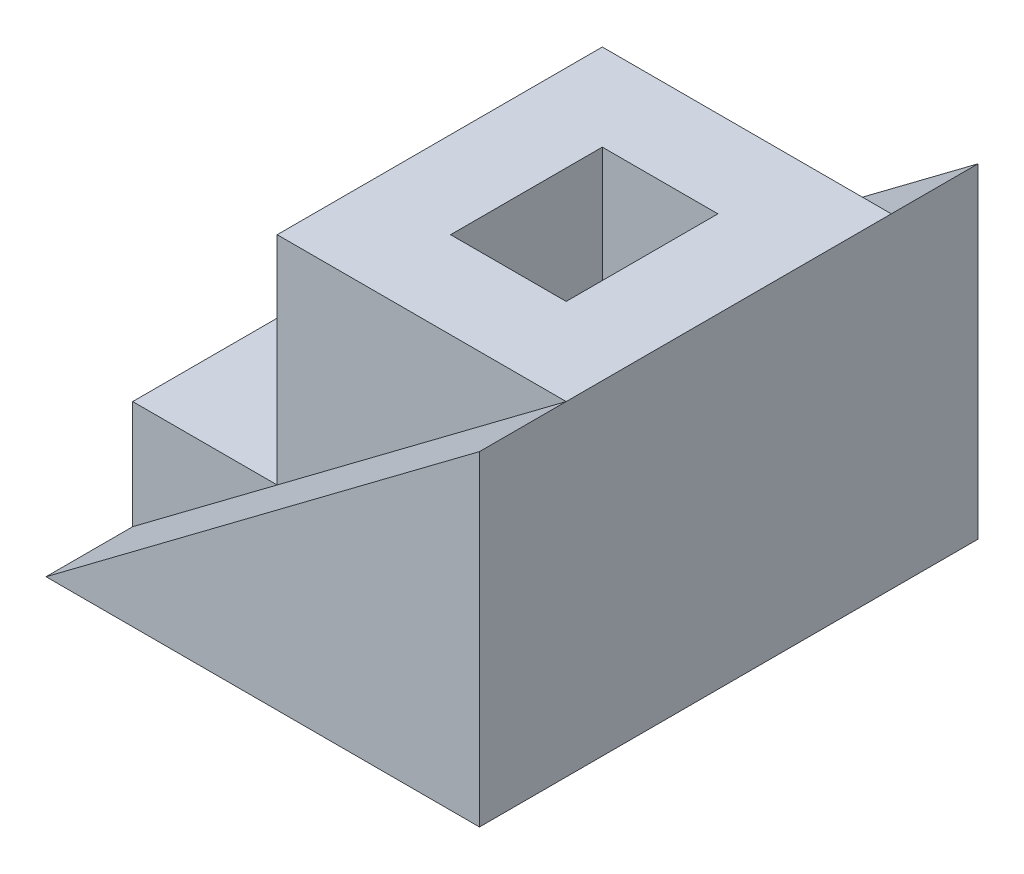
ISO-10303-21;
HEADER;
FILE_DESCRIPTION(('STEP AP214'),'2;1');
FILE_NAME('part.step','',(''),(''),'','','');
FILE_SCHEMA(('AUTOMOTIVE_DESIGN { 1 0 10303 214 1 1 1 1 }'));
ENDSEC;
DATA;
#1=APPLICATION_CONTEXT('core data for automotive mechanical design processes');
#2=APPLICATION_PROTOCOL_DEFINITION('international standard','automotive_design',2000,#1);
#3=PRODUCT_CONTEXT('',#1,'mechanical');
#4=PRODUCT('Part','Part','',(#3));
#5=PRODUCT_RELATED_PRODUCT_CATEGORY('part','',(#4));
#6=PRODUCT_DEFINITION_FORMATION('','',#4);
#7=PRODUCT_DEFINITION_CONTEXT('part definition',#1,'design');
#8=PRODUCT_DEFINITION('design','',#6,#7);
#9=PRODUCT_DEFINITION_SHAPE('','',#8);
#10=(LENGTH_UNIT() NAMED_UNIT(*) SI_UNIT(.MILLI.,.METRE.));
#11=(NAMED_UNIT(*) PLANE_ANGLE_UNIT() SI_UNIT($,.RADIAN.));
#12=(NAMED_UNIT(*) SI_UNIT($,.STERADIAN.) SOLID_ANGLE_UNIT());
#13=UNCERTAINTY_MEASURE_WITH_UNIT(LENGTH_MEASURE(1.E-05),#10,'distance_accuracy_value','');
#14=(GEOMETRIC_REPRESENTATION_CONTEXT(3) GLOBAL_UNCERTAINTY_ASSIGNED_CONTEXT((#13)) GLOBAL_UNIT_ASSIGNED_CONTEXT((#10,
#11,#12)) REPRESENTATION_CONTEXT('',''));
#15=CARTESIAN_POINT('',(0.,0.,0.));
#16=DIRECTION('',(0.,0.,1.));
#17=DIRECTION('',(1.,0.,0.));
#18=AXIS2_PLACEMENT_3D('',#15,#16,#17);
#19=CARTESIAN_POINT('',(0.,0.,-15.));
#20=DIRECTION('',(0.,0.,1.));
#21=DIRECTION('',(1.,0.,0.));
#22=AXIS2_PLACEMENT_3D('',#19,#20,#21);
#23=PLANE('',#22);
#24=DIRECTION('',(1.,0.,0.));
#25=VECTOR('',#24,1.);
#26=CARTESIAN_POINT('',(0.,15.,-15.));
#27=LINE('',#26,#25);
#28=CARTESIAN_POINT('',(-6.66666666666666,15.,-15.));
#29=VERTEX_POINT('',#28);
#30=CARTESIAN_POINT('',(20.,15.,-15.));
#31=VERTEX_POINT('',#30);
#32=EDGE_CURVE('E212',#29,#31,#27,.T.);
#33=ORIENTED_EDGE('',*,*,#32,.T.);
#34=DIRECTION('',(-0.8,-0.6,0.));
#35=VECTOR('',#34,1.);
#36=CARTESIAN_POINT('',(-20.,-15.,-15.));
#37=LINE('',#36,#35);
#38=CARTESIAN_POINT('',(-6.66666666666666,-5.,-15.));
#39=VERTEX_POINT('',#38);
#40=EDGE_CURVE('E45',#31,#39,#37,.T.);
#41=ORIENTED_EDGE('',*,*,#40,.T.);
#42=DIRECTION('',(0.,1.,0.));
#43=VECTOR('',#42,1.);
#44=CARTESIAN_POINT('',(-6.66666666666666,0.,-15.));
#45=LINE('',#44,#43);
#46=EDGE_CURVE('E204',#39,#29,#45,.T.);
#47=ORIENTED_EDGE('',*,*,#46,.T.);
#48=EDGE_LOOP('',(#33,#41,#47));
#49=FACE_BOUND('',#48,.T.);
#50=ADVANCED_FACE('F34',(#49),#23,.F.);
#51=CARTESIAN_POINT('',(0.,0.,15.));
#52=DIRECTION('',(0.,0.,1.));
#53=DIRECTION('',(1.,0.,0.));
#54=AXIS2_PLACEMENT_3D('',#51,#52,#53);
#55=PLANE('',#54);
#56=DIRECTION('',(-0.8,-0.6,0.));
#57=VECTOR('',#56,1.);
#58=CARTESIAN_POINT('',(-20.,-15.,15.));
#59=LINE('',#58,#57);
#60=CARTESIAN_POINT('',(20.,15.,15.));
#61=VERTEX_POINT('',#60);
#62=CARTESIAN_POINT('',(-6.66666666666666,-5.,15.));
#63=VERTEX_POINT('',#62);
#64=EDGE_CURVE('E176',#61,#63,#59,.T.);
#65=ORIENTED_EDGE('',*,*,#64,.F.);
#66=DIRECTION('',(1.,0.,0.));
#67=VECTOR('',#66,1.);
#68=CARTESIAN_POINT('',(0.,15.,15.));
#69=LINE('',#68,#67);
#70=CARTESIAN_POINT('',(-6.66666666666666,15.,15.));
#71=VERTEX_POINT('',#70);
#72=EDGE_CURVE('E201',#71,#61,#69,.T.);
#73=ORIENTED_EDGE('',*,*,#72,.F.);
#74=DIRECTION('',(0.,1.,0.));
#75=VECTOR('',#74,1.);
#76=CARTESIAN_POINT('',(-6.66666666666666,0.,15.));
#77=LINE('',#76,#75);
#78=EDGE_CURVE('E192',#63,#71,#77,.T.);
#79=ORIENTED_EDGE('',*,*,#78,.F.);
#80=EDGE_LOOP('',(#65,#73,#79));
#81=FACE_BOUND('',#80,.T.);
#82=ADVANCED_FACE('F237',(#81),#55,.T.);
#83=CARTESIAN_POINT('',(-6.66666666666666,0.,-15.));
#84=DIRECTION('',(1.,0.,0.));
#85=DIRECTION('',(0.,0.,-1.));
#86=AXIS2_PLACEMENT_3D('',#83,#84,#85);
#87=PLANE('',#86);
#88=DIRECTION('',(0.,0.,1.));
#89=VECTOR('',#88,1.);
#90=CARTESIAN_POINT('',(-6.66666666666666,-5.,-15.));
#91=LINE('',#90,#89);
#92=EDGE_CURVE('E38',#39,#63,#91,.T.);
#93=ORIENTED_EDGE('',*,*,#92,.T.);
#94=ORIENTED_EDGE('',*,*,#78,.T.);
#95=DIRECTION('',(0.,0.,1.));
#96=VECTOR('',#95,1.);
#97=CARTESIAN_POINT('',(-6.66666666666666,15.,-15.));
#98=LINE('',#97,#96);
#99=EDGE_CURVE('E215',#29,#71,#98,.T.);
#100=ORIENTED_EDGE('',*,*,#99,.F.);
#101=ORIENTED_EDGE('',*,*,#46,.F.);
#102=EDGE_LOOP('',(#93,#94,#100,#101));
#103=FACE_BOUND('',#102,.T.);
#104=ADVANCED_FACE('F36',(#103),#87,.F.);
#105=CARTESIAN_POINT('',(0.,15.,-15.));
#106=DIRECTION('',(0.,-1.,0.));
#107=DIRECTION('',(0.,0.,-1.));
#108=AXIS2_PLACEMENT_3D('',#105,#106,#107);
#109=PLANE('',#108);
#110=DIRECTION('',(1.,0.,0.));
#111=VECTOR('',#110,1.);
#112=CARTESIAN_POINT('',(1.33333333333334,15.,7.));
#113=LINE('',#112,#111);
#114=CARTESIAN_POINT('',(1.33333333333334,15.,7.));
#115=VERTEX_POINT('',#114);
#116=CARTESIAN_POINT('',(12.,15.,7.));
#117=VERTEX_POINT('',#116);
#118=EDGE_CURVE('E153',#115,#117,#113,.T.);
#119=ORIENTED_EDGE('',*,*,#118,.F.);
#120=DIRECTION('',(0.,0.,1.));
#121=VECTOR('',#120,1.);
#122=CARTESIAN_POINT('',(1.33333333333334,15.,-7.));
#123=LINE('',#122,#121);
#124=CARTESIAN_POINT('',(1.33333333333334,15.,-7.));
#125=VERTEX_POINT('',#124);
#126=EDGE_CURVE('E52',#125,#115,#123,.T.);
#127=ORIENTED_EDGE('',*,*,#126,.F.);
#128=DIRECTION('',(-1.,0.,0.));
#129=VECTOR('',#128,1.);
#130=CARTESIAN_POINT('',(12.,15.,-7.));
#131=LINE('',#130,#129);
#132=CARTESIAN_POINT('',(12.,15.,-7.));
#133=VERTEX_POINT('',#132);
#134=EDGE_CURVE('E144',#133,#125,#131,.T.);
#135=ORIENTED_EDGE('',*,*,#134,.F.);
#136=DIRECTION('',(0.,0.,-1.));
#137=VECTOR('',#136,1.);
#138=CARTESIAN_POINT('',(12.,15.,7.));
#139=LINE('',#138,#137);
#140=EDGE_CURVE('E147',#117,#133,#139,.T.);
#141=ORIENTED_EDGE('',*,*,#140,.F.);
#142=EDGE_LOOP('',(#119,#127,#135,#141));
#143=FACE_BOUND('',#142,.T.);
#144=ORIENTED_EDGE('',*,*,#99,.T.);
#145=ORIENTED_EDGE('',*,*,#72,.T.);
#146=DIRECTION('',(0.,0.,1.));
#147=VECTOR('',#146,1.);
#148=CARTESIAN_POINT('',(20.,15.,-15.));
#149=LINE('',#148,#147);
#150=EDGE_CURVE('E217',#31,#61,#149,.T.);
#151=ORIENTED_EDGE('',*,*,#150,.F.);
#152=ORIENTED_EDGE('',*,*,#32,.F.);
#153=EDGE_LOOP('',(#144,#145,#151,#152));
#154=FACE_BOUND('',#153,.T.);
#155=ADVANCED_FACE('F252',(#143,#154),#109,.F.);
#156=CARTESIAN_POINT('',(20.,0.,-15.));
#157=DIRECTION('',(1.,0.,0.));
#158=DIRECTION('',(0.,0.,-1.));
#159=AXIS2_PLACEMENT_3D('',#156,#157,#158);
#160=PLANE('',#159);
#161=ORIENTED_EDGE('',*,*,#150,.T.);
#162=DIRECTION('',(0.,0.,-1.));
#163=VECTOR('',#162,1.);
#164=CARTESIAN_POINT('',(20.,15.,23.));
#165=LINE('',#164,#163);
#166=CARTESIAN_POINT('',(20.,15.,23.));
#167=VERTEX_POINT('',#166);
#168=EDGE_CURVE('E189',#167,#61,#165,.T.);
#169=ORIENTED_EDGE('',*,*,#168,.F.);
#170=DIRECTION('',(0.,1.,0.));
#171=VECTOR('',#170,1.);
#172=CARTESIAN_POINT('',(20.,15.,23.));
#173=LINE('',#172,#171);
#174=CARTESIAN_POINT('',(20.,-15.,23.));
#175=VERTEX_POINT('',#174);
#176=EDGE_CURVE('E180',#175,#167,#173,.T.);
#177=ORIENTED_EDGE('',*,*,#176,.F.);
#178=DIRECTION('',(0.,0.,1.));
#179=VECTOR('',#178,1.);
#180=CARTESIAN_POINT('',(20.,-15.,-15.));
#181=LINE('',#180,#179);
#182=CARTESIAN_POINT('',(20.,-15.,-23.));
#183=VERTEX_POINT('',#182);
#184=EDGE_CURVE('E220',#183,#175,#181,.T.);
#185=ORIENTED_EDGE('',*,*,#184,.F.);
#186=DIRECTION('',(0.,1.,0.));
#187=VECTOR('',#186,1.);
#188=CARTESIAN_POINT('',(20.,15.,-23.));
#189=LINE('',#188,#187);
#190=CARTESIAN_POINT('',(20.,15.,-23.));
#191=VERTEX_POINT('',#190);
#192=EDGE_CURVE('E168',#183,#191,#189,.T.);
#193=ORIENTED_EDGE('',*,*,#192,.T.);
#194=DIRECTION('',(0.,0.,1.));
#195=VECTOR('',#194,1.);
#196=CARTESIAN_POINT('',(20.,15.,-23.));
#197=LINE('',#196,#195);
#198=EDGE_CURVE('E170',#191,#31,#197,.T.);
#199=ORIENTED_EDGE('',*,*,#198,.T.);
#200=EDGE_LOOP('',(#161,#169,#177,#185,#193,#199));
#201=FACE_BOUND('',#200,.T.);
#202=ADVANCED_FACE('F248',(#201),#160,.T.);
#203=CARTESIAN_POINT('',(0.,-15.,-15.));
#204=DIRECTION('',(0.,-1.,0.));
#205=DIRECTION('',(0.,0.,-1.));
#206=AXIS2_PLACEMENT_3D('',#203,#204,#205);
#207=PLANE('',#206);
#208=DIRECTION('',(0.,0.,1.));
#209=VECTOR('',#208,1.);
#210=CARTESIAN_POINT('',(1.33333333333334,-15.,-7.));
#211=LINE('',#210,#209);
#212=CARTESIAN_POINT('',(1.33333333333334,-15.,-7.));
#213=VERTEX_POINT('',#212);
#214=CARTESIAN_POINT('',(1.33333333333334,-15.,7.));
#215=VERTEX_POINT('',#214);
#216=EDGE_CURVE('E128',#213,#215,#211,.T.);
#217=ORIENTED_EDGE('',*,*,#216,.T.);
#218=DIRECTION('',(1.,0.,0.));
#219=VECTOR('',#218,1.);
#220=CARTESIAN_POINT('',(1.33333333333334,-15.,7.));
#221=LINE('',#220,#219);
#222=CARTESIAN_POINT('',(12.,-15.,7.));
#223=VERTEX_POINT('',#222);
#224=EDGE_CURVE('E137',#215,#223,#221,.T.);
#225=ORIENTED_EDGE('',*,*,#224,.T.);
#226=DIRECTION('',(0.,0.,-1.));
#227=VECTOR('',#226,1.);
#228=CARTESIAN_POINT('',(12.,-15.,7.));
#229=LINE('',#228,#227);
#230=CARTESIAN_POINT('',(12.,-15.,-7.));
#231=VERTEX_POINT('',#230);
#232=EDGE_CURVE('E60',#223,#231,#229,.T.);
#233=ORIENTED_EDGE('',*,*,#232,.T.);
#234=DIRECTION('',(-1.,0.,0.));
#235=VECTOR('',#234,1.);
#236=CARTESIAN_POINT('',(12.,-15.,-7.));
#237=LINE('',#236,#235);
#238=EDGE_CURVE('E134',#231,#213,#237,.T.);
#239=ORIENTED_EDGE('',*,*,#238,.T.);
#240=EDGE_LOOP('',(#217,#225,#233,#239));
#241=FACE_BOUND('',#240,.T.);
#242=ORIENTED_EDGE('',*,*,#184,.T.);
#243=DIRECTION('',(1.,0.,0.));
#244=VECTOR('',#243,1.);
#245=CARTESIAN_POINT('',(20.,-15.,23.));
#246=LINE('',#245,#244);
#247=CARTESIAN_POINT('',(-20.,-15.,23.));
#248=VERTEX_POINT('',#247);
#249=EDGE_CURVE('E177',#248,#175,#246,.T.);
#250=ORIENTED_EDGE('',*,*,#249,.F.);
#251=DIRECTION('',(0.,0.,-1.));
#252=VECTOR('',#251,1.);
#253=CARTESIAN_POINT('',(-20.,-15.,23.));
#254=LINE('',#253,#252);
#255=CARTESIAN_POINT('',(-20.,-15.,15.));
#256=VERTEX_POINT('',#255);
#257=EDGE_CURVE('E184',#248,#256,#254,.T.);
#258=ORIENTED_EDGE('',*,*,#257,.T.);
#259=DIRECTION('',(0.,0.,1.));
#260=VECTOR('',#259,1.);
#261=CARTESIAN_POINT('',(-20.,-15.,-15.));
#262=LINE('',#261,#260);
#263=CARTESIAN_POINT('',(-20.,-15.,-15.));
#264=VERTEX_POINT('',#263);
#265=EDGE_CURVE('E222',#264,#256,#262,.T.);
#266=ORIENTED_EDGE('',*,*,#265,.F.);
#267=DIRECTION('',(0.,0.,1.));
#268=VECTOR('',#267,1.);
#269=CARTESIAN_POINT('',(-20.,-15.,-23.));
#270=LINE('',#269,#268);
#271=CARTESIAN_POINT('',(-20.,-15.,-23.));
#272=VERTEX_POINT('',#271);
#273=EDGE_CURVE('E174',#272,#264,#270,.T.);
#274=ORIENTED_EDGE('',*,*,#273,.F.);
#275=DIRECTION('',(1.,0.,0.));
#276=VECTOR('',#275,1.);
#277=CARTESIAN_POINT('',(20.,-15.,-23.));
#278=LINE('',#277,#276);
#279=EDGE_CURVE('E162',#272,#183,#278,.T.);
#280=ORIENTED_EDGE('',*,*,#279,.T.);
#281=EDGE_LOOP('',(#242,#250,#258,#266,#274,#280));
#282=FACE_BOUND('',#281,.T.);
#283=ADVANCED_FACE('F141',(#241,#282),#207,.T.);
#284=CARTESIAN_POINT('',(-20.,0.,-15.));
#285=DIRECTION('',(1.,0.,0.));
#286=DIRECTION('',(0.,0.,-1.));
#287=AXIS2_PLACEMENT_3D('',#284,#285,#286);
#288=PLANE('',#287);
#289=ORIENTED_EDGE('',*,*,#265,.T.);
#290=DIRECTION('',(0.,1.,0.));
#291=VECTOR('',#290,1.);
#292=CARTESIAN_POINT('',(-20.,0.,15.));
#293=LINE('',#292,#291);
#294=CARTESIAN_POINT('',(-20.,-5.,15.));
#295=VERTEX_POINT('',#294);
#296=EDGE_CURVE('E198',#256,#295,#293,.T.);
#297=ORIENTED_EDGE('',*,*,#296,.T.);
#298=DIRECTION('',(0.,0.,1.));
#299=VECTOR('',#298,1.);
#300=CARTESIAN_POINT('',(-20.,-5.,-15.));
#301=LINE('',#300,#299);
#302=CARTESIAN_POINT('',(-20.,-5.,-15.));
#303=VERTEX_POINT('',#302);
#304=EDGE_CURVE('E224',#303,#295,#301,.T.);
#305=ORIENTED_EDGE('',*,*,#304,.F.);
#306=DIRECTION('',(0.,1.,0.));
#307=VECTOR('',#306,1.);
#308=CARTESIAN_POINT('',(-20.,0.,-15.));
#309=LINE('',#308,#307);
#310=EDGE_CURVE('E210',#264,#303,#309,.T.);
#311=ORIENTED_EDGE('',*,*,#310,.F.);
#312=EDGE_LOOP('',(#289,#297,#305,#311));
#313=FACE_BOUND('',#312,.T.);
#314=ADVANCED_FACE('F260',(#313),#288,.F.);
#315=CARTESIAN_POINT('',(0.,-5.,-15.));
#316=DIRECTION('',(0.,-1.,0.));
#317=DIRECTION('',(0.,0.,-1.));
#318=AXIS2_PLACEMENT_3D('',#315,#316,#317);
#319=PLANE('',#318);
#320=ORIENTED_EDGE('',*,*,#304,.T.);
#321=DIRECTION('',(1.,0.,0.));
#322=VECTOR('',#321,1.);
#323=CARTESIAN_POINT('',(0.,-5.,15.));
#324=LINE('',#323,#322);
#325=EDGE_CURVE('E195',#295,#63,#324,.T.);
#326=ORIENTED_EDGE('',*,*,#325,.T.);
#327=ORIENTED_EDGE('',*,*,#92,.F.);
#328=DIRECTION('',(1.,0.,0.));
#329=VECTOR('',#328,1.);
#330=CARTESIAN_POINT('',(0.,-5.,-15.));
#331=LINE('',#330,#329);
#332=EDGE_CURVE('E207',#303,#39,#331,.T.);
#333=ORIENTED_EDGE('',*,*,#332,.F.);
#334=EDGE_LOOP('',(#320,#326,#327,#333));
#335=FACE_BOUND('',#334,.T.);
#336=ADVANCED_FACE('F238',(#335),#319,.F.);
#337=ORIENTED_EDGE('',*,*,#332,.T.);
#338=EDGE_CURVE('E11',#39,#264,#37,.T.);
#339=ORIENTED_EDGE('',*,*,#338,.T.);
#340=ORIENTED_EDGE('',*,*,#310,.T.);
#341=EDGE_LOOP('',(#337,#339,#340));
#342=FACE_BOUND('',#341,.T.);
#343=ADVANCED_FACE('F256',(#342),#23,.F.);
#344=EDGE_CURVE('E43',#63,#256,#59,.T.);
#345=ORIENTED_EDGE('',*,*,#344,.F.);
#346=ORIENTED_EDGE('',*,*,#325,.F.);
#347=ORIENTED_EDGE('',*,*,#296,.F.);
#348=EDGE_LOOP('',(#345,#346,#347));
#349=FACE_BOUND('',#348,.T.);
#350=ADVANCED_FACE('F261',(#349),#55,.T.);
#351=CARTESIAN_POINT('',(-20.,-15.,23.));
#352=DIRECTION('',(0.6,-0.8,0.));
#353=DIRECTION('',(0.8,0.6,0.));
#354=AXIS2_PLACEMENT_3D('',#351,#352,#353);
#355=PLANE('',#354);
#356=ORIENTED_EDGE('',*,*,#64,.T.);
#357=ORIENTED_EDGE('',*,*,#344,.T.);
#358=ORIENTED_EDGE('',*,*,#257,.F.);
#359=DIRECTION('',(-0.8,-0.6,0.));
#360=VECTOR('',#359,1.);
#361=CARTESIAN_POINT('',(-20.,-15.,23.));
#362=LINE('',#361,#360);
#363=EDGE_CURVE('E182',#167,#248,#362,.T.);
#364=ORIENTED_EDGE('',*,*,#363,.F.);
#365=ORIENTED_EDGE('',*,*,#168,.T.);
#366=EDGE_LOOP('',(#356,#357,#358,#364,#365));
#367=FACE_BOUND('',#366,.T.);
#368=ADVANCED_FACE('F242',(#367),#355,.F.);
#369=CARTESIAN_POINT('',(0.,0.,23.));
#370=DIRECTION('',(0.,0.,1.));
#371=DIRECTION('',(1.,0.,0.));
#372=AXIS2_PLACEMENT_3D('',#369,#370,#371);
#373=PLANE('',#372);
#374=ORIENTED_EDGE('',*,*,#249,.T.);
#375=ORIENTED_EDGE('',*,*,#176,.T.);
#376=ORIENTED_EDGE('',*,*,#363,.T.);
#377=EDGE_LOOP('',(#374,#375,#376));
#378=FACE_BOUND('',#377,.T.);
#379=ADVANCED_FACE('F268',(#378),#373,.T.);
#380=CARTESIAN_POINT('',(-20.,-15.,-23.));
#381=DIRECTION('',(-0.6,0.8,0.));
#382=DIRECTION('',(-0.8,-0.6,0.));
#383=AXIS2_PLACEMENT_3D('',#380,#381,#382);
#384=PLANE('',#383);
#385=ORIENTED_EDGE('',*,*,#40,.F.);
#386=ORIENTED_EDGE('',*,*,#198,.F.);
#387=DIRECTION('',(-0.8,-0.6,0.));
#388=VECTOR('',#387,1.);
#389=CARTESIAN_POINT('',(-20.,-15.,-23.));
#390=LINE('',#389,#388);
#391=EDGE_CURVE('E165',#191,#272,#390,.T.);
#392=ORIENTED_EDGE('',*,*,#391,.T.);
#393=ORIENTED_EDGE('',*,*,#273,.T.);
#394=ORIENTED_EDGE('',*,*,#338,.F.);
#395=EDGE_LOOP('',(#385,#386,#392,#393,#394));
#396=FACE_BOUND('',#395,.T.);
#397=ADVANCED_FACE('F299',(#396),#384,.T.);
#398=CARTESIAN_POINT('',(0.,0.,-23.));
#399=DIRECTION('',(0.,0.,-1.));
#400=DIRECTION('',(1.,0.,0.));
#401=AXIS2_PLACEMENT_3D('',#398,#399,#400);
#402=PLANE('',#401);
#403=ORIENTED_EDGE('',*,*,#279,.F.);
#404=ORIENTED_EDGE('',*,*,#391,.F.);
#405=ORIENTED_EDGE('',*,*,#192,.F.);
#406=EDGE_LOOP('',(#403,#404,#405));
#407=FACE_BOUND('',#406,.T.);
#408=ADVANCED_FACE('F304',(#407),#402,.T.);
#409=CARTESIAN_POINT('',(1.33333333333334,-15.,-7.));
#410=DIRECTION('',(-1.,0.,0.));
#411=DIRECTION('',(0.,0.,1.));
#412=AXIS2_PLACEMENT_3D('',#409,#410,#411);
#413=PLANE('',#412);
#414=ORIENTED_EDGE('',*,*,#126,.T.);
#415=DIRECTION('',(0.,1.,0.));
#416=VECTOR('',#415,1.);
#417=CARTESIAN_POINT('',(1.33333333333334,-15.,7.));
#418=LINE('',#417,#416);
#419=EDGE_CURVE('E124',#215,#115,#418,.T.);
#420=ORIENTED_EDGE('',*,*,#419,.F.);
#421=ORIENTED_EDGE('',*,*,#216,.F.);
#422=DIRECTION('',(0.,1.,0.));
#423=VECTOR('',#422,1.);
#424=CARTESIAN_POINT('',(1.33333333333334,-15.,-7.));
#425=LINE('',#424,#423);
#426=EDGE_CURVE('E157',#213,#125,#425,.T.);
#427=ORIENTED_EDGE('',*,*,#426,.T.);
#428=EDGE_LOOP('',(#414,#420,#421,#427));
#429=FACE_BOUND('',#428,.T.);
#430=ADVANCED_FACE('F126',(#429),#413,.F.);
#431=CARTESIAN_POINT('',(12.,-15.,-7.));
#432=DIRECTION('',(0.,0.,-1.));
#433=DIRECTION('',(-1.,0.,0.));
#434=AXIS2_PLACEMENT_3D('',#431,#432,#433);
#435=PLANE('',#434);
#436=ORIENTED_EDGE('',*,*,#134,.T.);
#437=ORIENTED_EDGE('',*,*,#426,.F.);
#438=ORIENTED_EDGE('',*,*,#238,.F.);
#439=DIRECTION('',(0.,1.,0.));
#440=VECTOR('',#439,1.);
#441=CARTESIAN_POINT('',(12.,-15.,-7.));
#442=LINE('',#441,#440);
#443=EDGE_CURVE('E159',#231,#133,#442,.T.);
#444=ORIENTED_EDGE('',*,*,#443,.T.);
#445=EDGE_LOOP('',(#436,#437,#438,#444));
#446=FACE_BOUND('',#445,.T.);
#447=ADVANCED_FACE('F340',(#446),#435,.F.);
#448=CARTESIAN_POINT('',(12.,-15.,7.));
#449=DIRECTION('',(1.,0.,0.));
#450=DIRECTION('',(0.,0.,-1.));
#451=AXIS2_PLACEMENT_3D('',#448,#449,#450);
#452=PLANE('',#451);
#453=ORIENTED_EDGE('',*,*,#140,.T.);
#454=ORIENTED_EDGE('',*,*,#443,.F.);
#455=ORIENTED_EDGE('',*,*,#232,.F.);
#456=DIRECTION('',(0.,1.,0.));
#457=VECTOR('',#456,1.);
#458=CARTESIAN_POINT('',(12.,-15.,7.));
#459=LINE('',#458,#457);
#460=EDGE_CURVE('E133',#223,#117,#459,.T.);
#461=ORIENTED_EDGE('',*,*,#460,.T.);
#462=EDGE_LOOP('',(#453,#454,#455,#461));
#463=FACE_BOUND('',#462,.T.);
#464=ADVANCED_FACE('F349',(#463),#452,.F.);
#465=CARTESIAN_POINT('',(1.33333333333334,-15.,7.));
#466=DIRECTION('',(0.,0.,1.));
#467=DIRECTION('',(1.,0.,0.));
#468=AXIS2_PLACEMENT_3D('',#465,#466,#467);
#469=PLANE('',#468);
#470=ORIENTED_EDGE('',*,*,#118,.T.);
#471=ORIENTED_EDGE('',*,*,#460,.F.);
#472=ORIENTED_EDGE('',*,*,#224,.F.);
#473=ORIENTED_EDGE('',*,*,#419,.T.);
#474=EDGE_LOOP('',(#470,#471,#472,#473));
#475=FACE_BOUND('',#474,.T.);
#476=ADVANCED_FACE('F138',(#475),#469,.F.);
#477=CLOSED_SHELL('',(#50,#82,#104,#155,#202,#283,#314,#336,#343,#350,#368,#379,#397,#408,#430,
#447,#464,#476));
#478=MANIFOLD_SOLID_BREP('B2',#477);
#479=ADVANCED_BREP_SHAPE_REPRESENTATION('',(#18,#478),#14);
#480=SHAPE_DEFINITION_REPRESENTATION(#9,#479);
ENDSEC;
END-ISO-10303-21;
